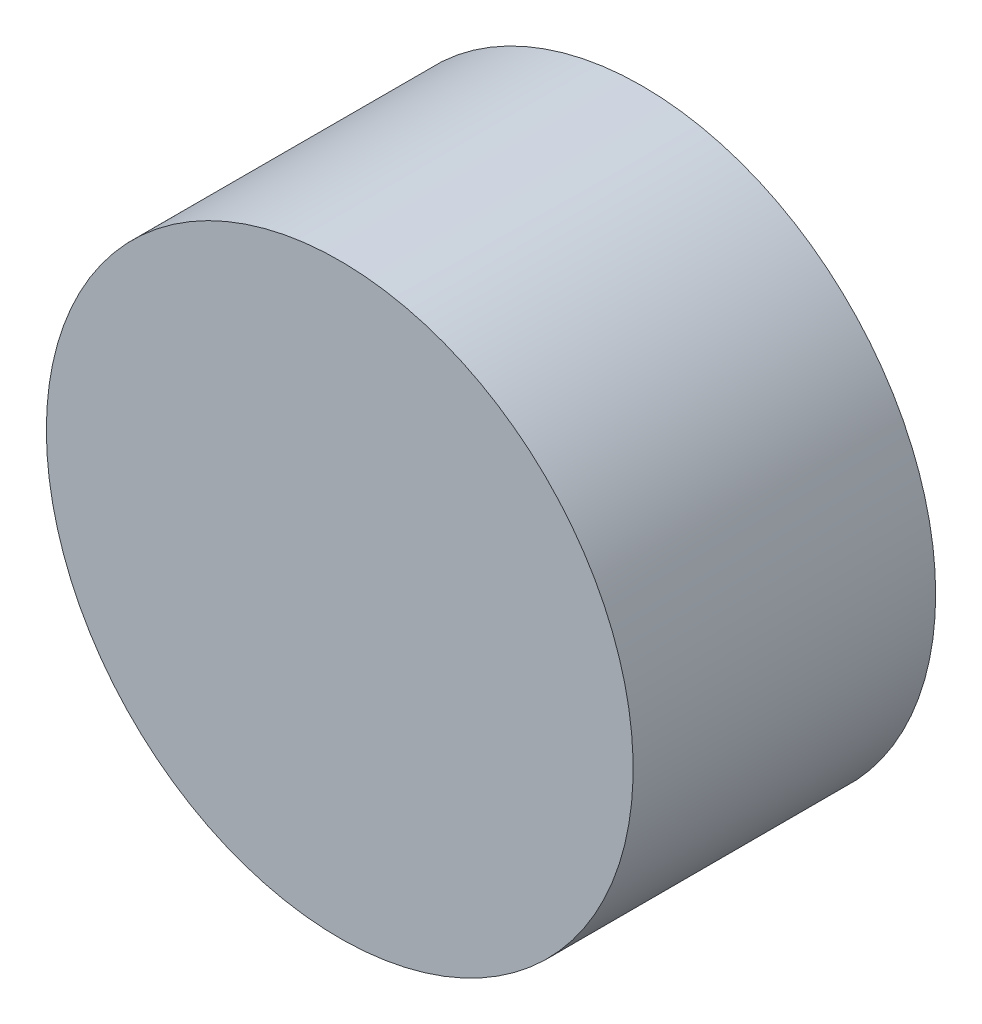
ISO-10303-21;
HEADER;
FILE_DESCRIPTION(('STEP AP214'),'2;1');
FILE_NAME('part.step','',(''),(''),'','','');
FILE_SCHEMA(('AUTOMOTIVE_DESIGN { 1 0 10303 214 1 1 1 1 }'));
ENDSEC;
DATA;
#1=APPLICATION_CONTEXT('core data for automotive mechanical design processes');
#2=APPLICATION_PROTOCOL_DEFINITION('international standard','automotive_design',2000,#1);
#3=PRODUCT_CONTEXT('',#1,'mechanical');
#4=PRODUCT('Part','Part','',(#3));
#5=PRODUCT_RELATED_PRODUCT_CATEGORY('part','',(#4));
#6=PRODUCT_DEFINITION_FORMATION('','',#4);
#7=PRODUCT_DEFINITION_CONTEXT('part definition',#1,'design');
#8=PRODUCT_DEFINITION('design','',#6,#7);
#9=PRODUCT_DEFINITION_SHAPE('','',#8);
#10=(LENGTH_UNIT() NAMED_UNIT(*) SI_UNIT(.MILLI.,.METRE.));
#11=(NAMED_UNIT(*) PLANE_ANGLE_UNIT() SI_UNIT($,.RADIAN.));
#12=(NAMED_UNIT(*) SI_UNIT($,.STERADIAN.) SOLID_ANGLE_UNIT());
#13=UNCERTAINTY_MEASURE_WITH_UNIT(LENGTH_MEASURE(1.E-05),#10,'distance_accuracy_value','');
#14=(GEOMETRIC_REPRESENTATION_CONTEXT(3) GLOBAL_UNCERTAINTY_ASSIGNED_CONTEXT((#13)) GLOBAL_UNIT_ASSIGNED_CONTEXT((#10,
#11,#12)) REPRESENTATION_CONTEXT('',''));
#15=CARTESIAN_POINT('',(0.,0.,0.));
#16=DIRECTION('',(0.,0.,1.));
#17=DIRECTION('',(1.,0.,0.));
#18=AXIS2_PLACEMENT_3D('',#15,#16,#17);
#19=CARTESIAN_POINT('',(0.,0.,0.));
#20=DIRECTION('',(0.,0.,1.));
#21=DIRECTION('',(1.,0.,0.));
#22=AXIS2_PLACEMENT_3D('',#19,#20,#21);
#23=PLANE('',#22);
#24=CARTESIAN_POINT('',(0.,0.,0.));
#25=DIRECTION('',(0.,0.,1.));
#26=DIRECTION('',(1.,0.,0.));
#27=AXIS2_PLACEMENT_3D('',#24,#25,#26);
#28=CIRCLE('',#27,48.496570744109);
#29=CARTESIAN_POINT('',(48.496570744109,0.,0.));
#30=VERTEX_POINT('',#29);
#31=EDGE_CURVE('E38',#30,#30,#28,.T.);
#32=ORIENTED_EDGE('',*,*,#31,.F.);
#33=EDGE_LOOP('',(#32));
#34=FACE_BOUND('',#33,.T.);
#35=ADVANCED_FACE('F31',(#34),#23,.F.);
#36=CARTESIAN_POINT('',(0.,0.,187.16901614981));
#37=DIRECTION('',(0.,0.,-1.));
#38=DIRECTION('',(-1.,0.,0.));
#39=AXIS2_PLACEMENT_3D('',#36,#37,#38);
#40=CYLINDRICAL_SURFACE('',#39,48.496570744109);
#41=CARTESIAN_POINT('',(0.,0.,50.));
#42=DIRECTION('',(0.,0.,-1.));
#43=DIRECTION('',(-1.,0.,0.));
#44=AXIS2_PLACEMENT_3D('',#41,#42,#43);
#45=CIRCLE('',#44,48.496570744109);
#46=CARTESIAN_POINT('',(-48.496570744109,0.,50.));
#47=VERTEX_POINT('',#46);
#48=EDGE_CURVE('E10',#47,#47,#45,.T.);
#49=ORIENTED_EDGE('',*,*,#48,.T.);
#50=EDGE_LOOP('',(#49));
#51=FACE_BOUND('',#50,.T.);
#52=ORIENTED_EDGE('',*,*,#31,.T.);
#53=EDGE_LOOP('',(#52));
#54=FACE_BOUND('',#53,.T.);
#55=ADVANCED_FACE('F33',(#51,#54),#40,.T.);
#56=CARTESIAN_POINT('',(0.,0.,50.));
#57=DIRECTION('',(0.,0.,-1.));
#58=DIRECTION('',(-1.,0.,0.));
#59=AXIS2_PLACEMENT_3D('',#56,#57,#58);
#60=PLANE('',#59);
#61=ORIENTED_EDGE('',*,*,#48,.F.);
#62=EDGE_LOOP('',(#61));
#63=FACE_BOUND('',#62,.T.);
#64=ADVANCED_FACE('F49',(#63),#60,.F.);
#65=CLOSED_SHELL('',(#35,#55,#64));
#66=MANIFOLD_SOLID_BREP('B2',#65);
#67=ADVANCED_BREP_SHAPE_REPRESENTATION('',(#18,#66),#14);
#68=SHAPE_DEFINITION_REPRESENTATION(#9,#67);
ENDSEC;
END-ISO-10303-21;
